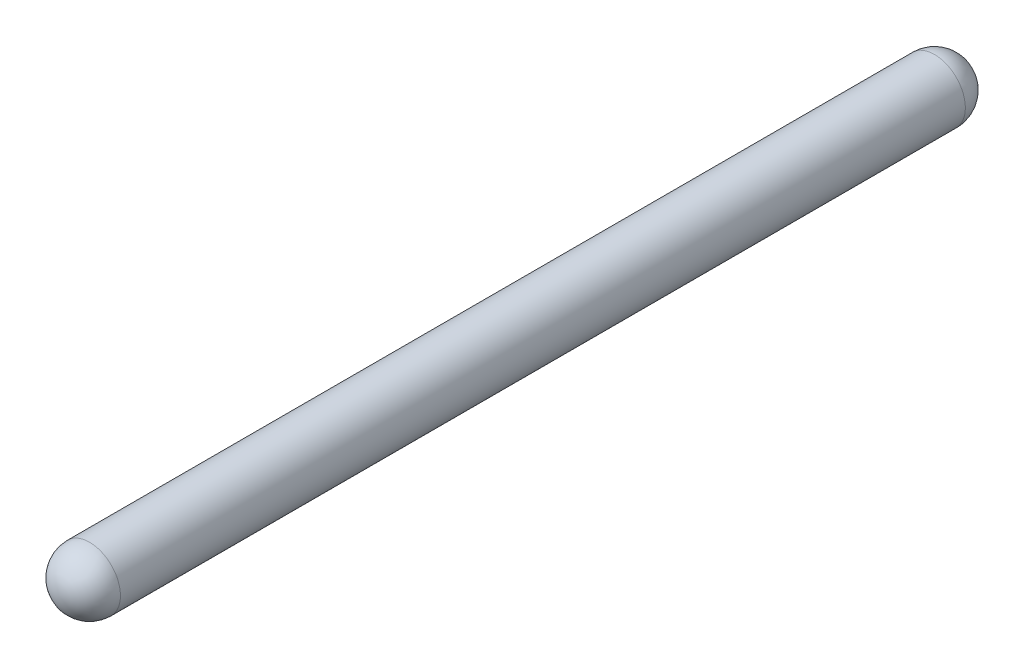
ISO-10303-21;
HEADER;
FILE_DESCRIPTION(('STEP AP214'),'2;1');
FILE_NAME('part.step','',(''),(''),'','','');
FILE_SCHEMA(('AUTOMOTIVE_DESIGN { 1 0 10303 214 1 1 1 1 }'));
ENDSEC;
DATA;
#1=APPLICATION_CONTEXT('core data for automotive mechanical design processes');
#2=APPLICATION_PROTOCOL_DEFINITION('international standard','automotive_design',2000,#1);
#3=PRODUCT_CONTEXT('',#1,'mechanical');
#4=PRODUCT('Part','Part','',(#3));
#5=PRODUCT_RELATED_PRODUCT_CATEGORY('part','',(#4));
#6=PRODUCT_DEFINITION_FORMATION('','',#4);
#7=PRODUCT_DEFINITION_CONTEXT('part definition',#1,'design');
#8=PRODUCT_DEFINITION('design','',#6,#7);
#9=PRODUCT_DEFINITION_SHAPE('','',#8);
#10=(LENGTH_UNIT() NAMED_UNIT(*) SI_UNIT(.MILLI.,.METRE.));
#11=(NAMED_UNIT(*) PLANE_ANGLE_UNIT() SI_UNIT($,.RADIAN.));
#12=(NAMED_UNIT(*) SI_UNIT($,.STERADIAN.) SOLID_ANGLE_UNIT());
#13=UNCERTAINTY_MEASURE_WITH_UNIT(LENGTH_MEASURE(1.E-05),#10,'distance_accuracy_value','');
#14=(GEOMETRIC_REPRESENTATION_CONTEXT(3) GLOBAL_UNCERTAINTY_ASSIGNED_CONTEXT((#13)) GLOBAL_UNIT_ASSIGNED_CONTEXT((#10,
#11,#12)) REPRESENTATION_CONTEXT('',''));
#15=CARTESIAN_POINT('',(0.,0.,0.));
#16=DIRECTION('',(0.,0.,1.));
#17=DIRECTION('',(1.,0.,0.));
#18=AXIS2_PLACEMENT_3D('',#15,#16,#17);
#19=CARTESIAN_POINT('',(-1.75,0.636826499221,8.115147590468));
#20=DIRECTION('',(0.,0.,-1.));
#21=DIRECTION('',(-0.754402916200536,0.656411639162597,0.));
#22=AXIS2_PLACEMENT_3D('',#19,#20,#21);
#23=CYLINDRICAL_SURFACE('',#22,0.375);
#24=CARTESIAN_POINT('',(-1.75,0.636826499221,7.740147590468));
#25=DIRECTION('',(0.,0.,-1.));
#26=DIRECTION('',(-0.754402916200536,0.656411639162597,0.));
#27=AXIS2_PLACEMENT_3D('',#24,#25,#26);
#28=CIRCLE('',#27,0.375);
#29=CARTESIAN_POINT('',(-2.0329010935752,0.882980863906974,7.740147590468));
#30=VERTEX_POINT('',#29);
#31=EDGE_CURVE('E25',#30,#30,#28,.T.);
#32=ORIENTED_EDGE('',*,*,#31,.T.);
#33=EDGE_LOOP('',(#32));
#34=FACE_BOUND('',#33,.T.);
#35=CARTESIAN_POINT('',(-1.75,0.636826499221,-2.509852409532));
#36=DIRECTION('',(0.,0.,-1.));
#37=DIRECTION('',(-0.754402916200536,0.656411639162597,0.));
#38=AXIS2_PLACEMENT_3D('',#35,#36,#37);
#39=CIRCLE('',#38,0.375);
#40=CARTESIAN_POINT('',(-2.0329010935752,0.882980863906974,-2.509852409532));
#41=VERTEX_POINT('',#40);
#42=EDGE_CURVE('E11',#41,#41,#39,.T.);
#43=ORIENTED_EDGE('',*,*,#42,.F.);
#44=EDGE_LOOP('',(#43));
#45=FACE_BOUND('',#44,.T.);
#46=ADVANCED_FACE('F17',(#34,#45),#23,.T.);
#47=CARTESIAN_POINT('',(-1.75,0.636826499221,-2.509852409532));
#48=DIRECTION('',(0.,0.,1.));
#49=DIRECTION('',(0.754402916200536,-0.656411639162597,0.));
#50=AXIS2_PLACEMENT_3D('',#47,#48,#49);
#51=SPHERICAL_SURFACE('',#50,0.375);
#52=ORIENTED_EDGE('',*,*,#42,.T.);
#53=EDGE_LOOP('',(#52));
#54=FACE_BOUND('',#53,.T.);
#55=ADVANCED_FACE('F57',(#54),#51,.T.);
#56=CARTESIAN_POINT('',(-1.75,0.636826499221,7.740147590468));
#57=DIRECTION('',(0.,0.,1.));
#58=DIRECTION('',(0.754402916200536,-0.656411639162597,0.));
#59=AXIS2_PLACEMENT_3D('',#56,#57,#58);
#60=SPHERICAL_SURFACE('',#59,0.375);
#61=ORIENTED_EDGE('',*,*,#31,.F.);
#62=EDGE_LOOP('',(#61));
#63=FACE_BOUND('',#62,.T.);
#64=ADVANCED_FACE('F52',(#63),#60,.T.);
#65=CLOSED_SHELL('',(#46,#55,#64));
#66=MANIFOLD_SOLID_BREP('B1',#65);
#67=ADVANCED_BREP_SHAPE_REPRESENTATION('',(#18,#66),#14);
#68=SHAPE_DEFINITION_REPRESENTATION(#9,#67);
ENDSEC;
END-ISO-10303-21;
